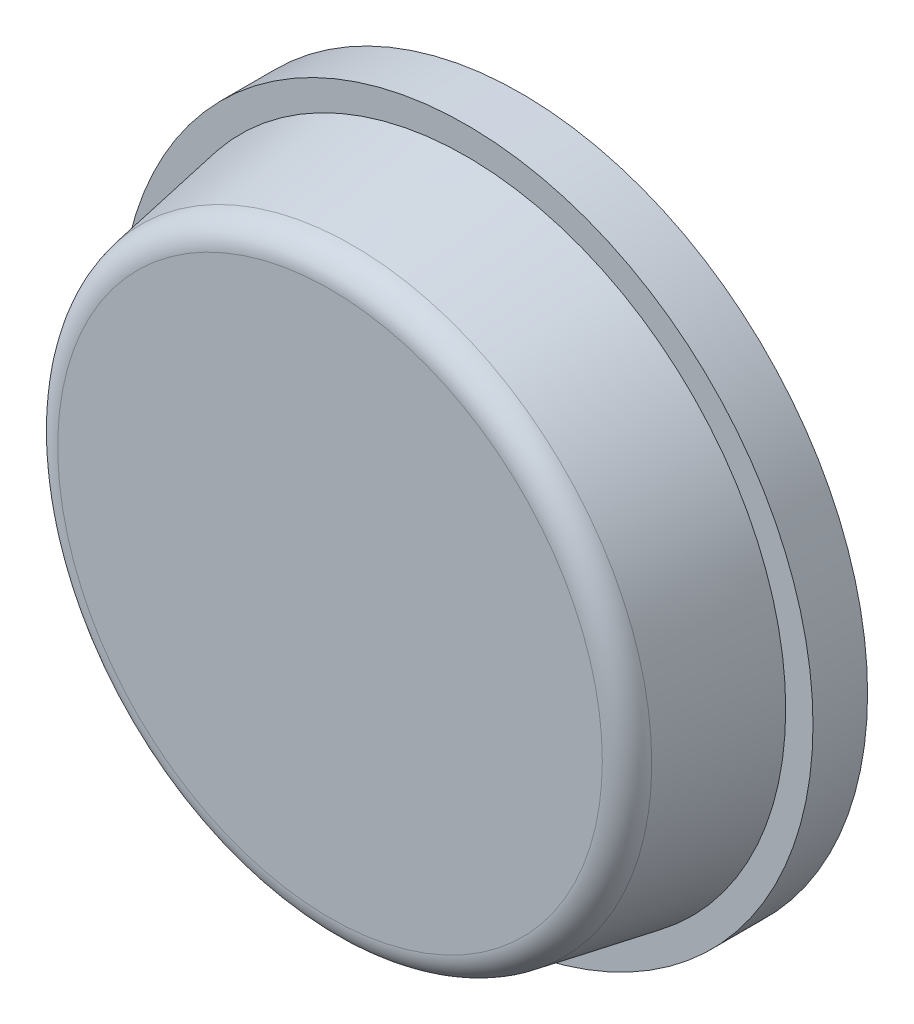
ISO-10303-21;
HEADER;
FILE_DESCRIPTION(('STEP AP214'),'2;1');
FILE_NAME('part.step','',(''),(''),'','','');
FILE_SCHEMA(('AUTOMOTIVE_DESIGN { 1 0 10303 214 1 1 1 1 }'));
ENDSEC;
DATA;
#1=APPLICATION_CONTEXT('core data for automotive mechanical design processes');
#2=APPLICATION_PROTOCOL_DEFINITION('international standard','automotive_design',2000,#1);
#3=PRODUCT_CONTEXT('',#1,'mechanical');
#4=PRODUCT('Part','Part','',(#3));
#5=PRODUCT_RELATED_PRODUCT_CATEGORY('part','',(#4));
#6=PRODUCT_DEFINITION_FORMATION('','',#4);
#7=PRODUCT_DEFINITION_CONTEXT('part definition',#1,'design');
#8=PRODUCT_DEFINITION('design','',#6,#7);
#9=PRODUCT_DEFINITION_SHAPE('','',#8);
#10=(LENGTH_UNIT() NAMED_UNIT(*) SI_UNIT(.MILLI.,.METRE.));
#11=(NAMED_UNIT(*) PLANE_ANGLE_UNIT() SI_UNIT($,.RADIAN.));
#12=(NAMED_UNIT(*) SI_UNIT($,.STERADIAN.) SOLID_ANGLE_UNIT());
#13=UNCERTAINTY_MEASURE_WITH_UNIT(LENGTH_MEASURE(1.E-05),#10,'distance_accuracy_value','');
#14=(GEOMETRIC_REPRESENTATION_CONTEXT(3) GLOBAL_UNCERTAINTY_ASSIGNED_CONTEXT((#13)) GLOBAL_UNIT_ASSIGNED_CONTEXT((#10,
#11,#12)) REPRESENTATION_CONTEXT('',''));
#15=CARTESIAN_POINT('',(0.,0.,0.));
#16=DIRECTION('',(0.,0.,1.));
#17=DIRECTION('',(1.,0.,0.));
#18=AXIS2_PLACEMENT_3D('',#15,#16,#17);
#19=CARTESIAN_POINT('',(0.,0.,1.));
#20=DIRECTION('',(0.,0.,-1.));
#21=DIRECTION('',(-1.,0.,0.));
#22=AXIS2_PLACEMENT_3D('',#19,#20,#21);
#23=CYLINDRICAL_SURFACE('',#22,6.35);
#24=CARTESIAN_POINT('',(0.,0.,1.));
#25=DIRECTION('',(0.,0.,1.));
#26=DIRECTION('',(1.,0.,0.));
#27=AXIS2_PLACEMENT_3D('',#24,#25,#26);
#28=CIRCLE('',#27,6.35);
#29=CARTESIAN_POINT('',(6.35,0.,1.));
#30=VERTEX_POINT('',#29);
#31=EDGE_CURVE('E73',#30,#30,#28,.T.);
#32=ORIENTED_EDGE('',*,*,#31,.F.);
#33=EDGE_LOOP('',(#32));
#34=FACE_BOUND('',#33,.T.);
#35=CARTESIAN_POINT('',(0.,0.,0.));
#36=DIRECTION('',(0.,0.,1.));
#37=DIRECTION('',(1.,0.,0.));
#38=AXIS2_PLACEMENT_3D('',#35,#36,#37);
#39=CIRCLE('',#38,6.35);
#40=CARTESIAN_POINT('',(6.35,0.,0.));
#41=VERTEX_POINT('',#40);
#42=EDGE_CURVE('E76',#41,#41,#39,.T.);
#43=ORIENTED_EDGE('',*,*,#42,.T.);
#44=EDGE_LOOP('',(#43));
#45=FACE_BOUND('',#44,.T.);
#46=ADVANCED_FACE('F53',(#34,#45),#23,.T.);
#47=CARTESIAN_POINT('',(0.,0.,1.));
#48=DIRECTION('',(0.,0.,1.));
#49=DIRECTION('',(1.,0.,0.));
#50=AXIS2_PLACEMENT_3D('',#47,#48,#49);
#51=PLANE('',#50);
#52=CARTESIAN_POINT('',(0.,0.,1.));
#53=DIRECTION('',(0.,0.,1.));
#54=DIRECTION('',(1.,0.,0.));
#55=AXIS2_PLACEMENT_3D('',#52,#53,#54);
#56=CIRCLE('',#55,5.85);
#57=CARTESIAN_POINT('',(5.85,0.,1.));
#58=VERTEX_POINT('',#57);
#59=EDGE_CURVE('E67',#58,#58,#56,.T.);
#60=ORIENTED_EDGE('',*,*,#59,.F.);
#61=EDGE_LOOP('',(#60));
#62=FACE_BOUND('',#61,.T.);
#63=ORIENTED_EDGE('',*,*,#31,.T.);
#64=EDGE_LOOP('',(#63));
#65=FACE_BOUND('',#64,.T.);
#66=ADVANCED_FACE('F85',(#62,#65),#51,.T.);
#67=CARTESIAN_POINT('',(0.,0.,0.));
#68=DIRECTION('',(0.,0.,1.));
#69=DIRECTION('',(1.,0.,0.));
#70=AXIS2_PLACEMENT_3D('',#67,#68,#69);
#71=PLANE('',#70);
#72=ORIENTED_EDGE('',*,*,#42,.F.);
#73=EDGE_LOOP('',(#72));
#74=FACE_BOUND('',#73,.T.);
#75=ADVANCED_FACE('F91',(#74),#71,.F.);
#76=CARTESIAN_POINT('',(0.,0.,1.));
#77=DIRECTION('',(0.,0.,-1.));
#78=DIRECTION('',(1.,0.,0.));
#79=AXIS2_PLACEMENT_3D('',#76,#77,#78);
#80=CONICAL_SURFACE('',#79,5.85,0.174532925199433);
#81=CARTESIAN_POINT('',(0.,0.,3.08682408883347));
#82=DIRECTION('',(0.,0.,-1.));
#83=DIRECTION('',(-1.,0.,0.));
#84=AXIS2_PLACEMENT_3D('',#81,#82,#83);
#85=CIRCLE('',#84,5.4820366091463);
#86=CARTESIAN_POINT('',(-5.4820366091463,0.,3.08682408883347));
#87=VERTEX_POINT('',#86);
#88=EDGE_CURVE('E10',#87,#87,#85,.T.);
#89=ORIENTED_EDGE('',*,*,#88,.T.);
#90=EDGE_LOOP('',(#89));
#91=FACE_BOUND('',#90,.T.);
#92=ORIENTED_EDGE('',*,*,#59,.T.);
#93=EDGE_LOOP('',(#92));
#94=FACE_BOUND('',#93,.T.);
#95=ADVANCED_FACE('F93',(#91,#94),#80,.T.);
#96=CARTESIAN_POINT('',(0.,0.,3.5));
#97=DIRECTION('',(0.,0.,1.));
#98=DIRECTION('',(1.,0.,0.));
#99=AXIS2_PLACEMENT_3D('',#96,#97,#98);
#100=PLANE('',#99);
#101=CARTESIAN_POINT('',(0.,0.,3.5));
#102=DIRECTION('',(0.,0.,1.));
#103=DIRECTION('',(1.,0.,0.));
#104=AXIS2_PLACEMENT_3D('',#101,#102,#103);
#105=CIRCLE('',#104,4.9896327326402);
#106=CARTESIAN_POINT('',(4.9896327326402,0.,3.5));
#107=VERTEX_POINT('',#106);
#108=EDGE_CURVE('E61',#107,#107,#105,.T.);
#109=ORIENTED_EDGE('',*,*,#108,.T.);
#110=EDGE_LOOP('',(#109));
#111=FACE_BOUND('',#110,.T.);
#112=ADVANCED_FACE('F99',(#111),#100,.T.);
#113=CARTESIAN_POINT('',(0.,0.,3.));
#114=DIRECTION('',(0.,0.,1.));
#115=DIRECTION('',(1.,0.,0.));
#116=AXIS2_PLACEMENT_3D('',#113,#114,#115);
#117=TOROIDAL_SURFACE('',#116,4.9896327326402,0.5);
#118=ORIENTED_EDGE('',*,*,#88,.F.);
#119=EDGE_LOOP('',(#118));
#120=FACE_BOUND('',#119,.T.);
#121=ORIENTED_EDGE('',*,*,#108,.F.);
#122=EDGE_LOOP('',(#121));
#123=FACE_BOUND('',#122,.T.);
#124=ADVANCED_FACE('F55',(#120,#123),#117,.T.);
#125=CLOSED_SHELL('',(#46,#66,#75,#95,#112,#124));
#126=MANIFOLD_SOLID_BREP('B2',#125);
#127=ADVANCED_BREP_SHAPE_REPRESENTATION('',(#18,#126),#14);
#128=SHAPE_DEFINITION_REPRESENTATION(#9,#127);
ENDSEC;
END-ISO-10303-21;
